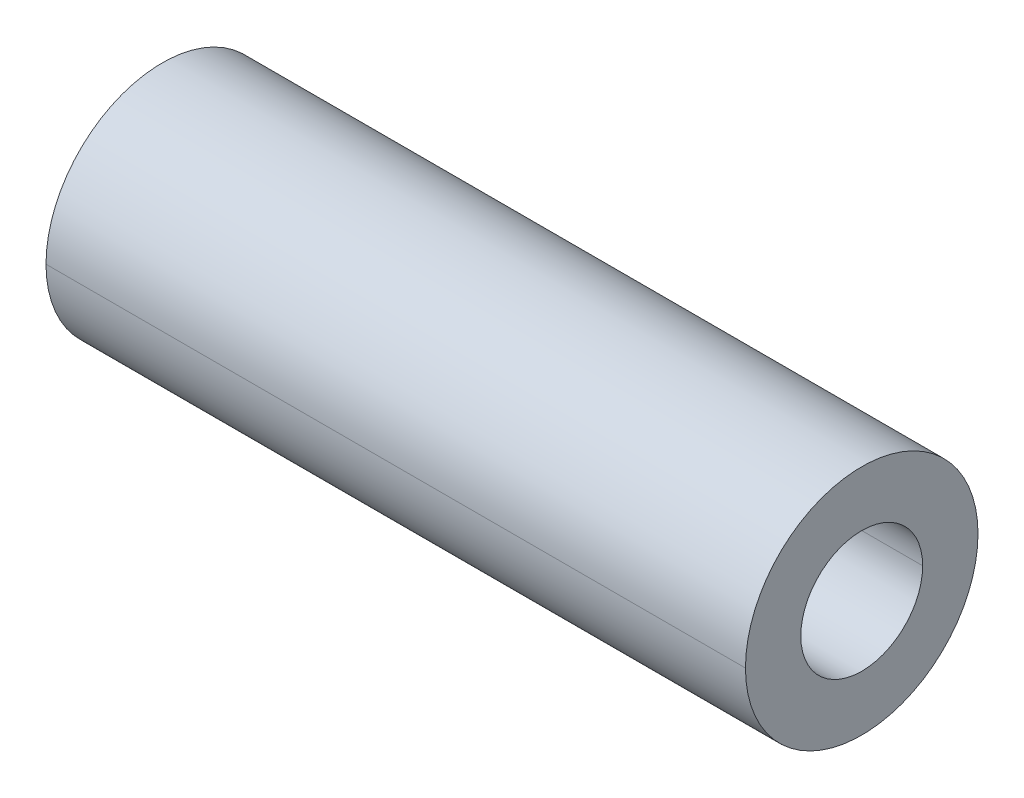
ISO-10303-21;
HEADER;
FILE_DESCRIPTION(('STEP AP214'),'2;1');
FILE_NAME('part.step','',(''),(''),'','','');
FILE_SCHEMA(('AUTOMOTIVE_DESIGN { 1 0 10303 214 1 1 1 1 }'));
ENDSEC;
DATA;
#1=APPLICATION_CONTEXT('core data for automotive mechanical design processes');
#2=APPLICATION_PROTOCOL_DEFINITION('international standard','automotive_design',2000,#1);
#3=PRODUCT_CONTEXT('',#1,'mechanical');
#4=PRODUCT('Part','Part','',(#3));
#5=PRODUCT_RELATED_PRODUCT_CATEGORY('part','',(#4));
#6=PRODUCT_DEFINITION_FORMATION('','',#4);
#7=PRODUCT_DEFINITION_CONTEXT('part definition',#1,'design');
#8=PRODUCT_DEFINITION('design','',#6,#7);
#9=PRODUCT_DEFINITION_SHAPE('','',#8);
#10=(LENGTH_UNIT() NAMED_UNIT(*) SI_UNIT(.MILLI.,.METRE.));
#11=(NAMED_UNIT(*) PLANE_ANGLE_UNIT() SI_UNIT($,.RADIAN.));
#12=(NAMED_UNIT(*) SI_UNIT($,.STERADIAN.) SOLID_ANGLE_UNIT());
#13=UNCERTAINTY_MEASURE_WITH_UNIT(LENGTH_MEASURE(1.E-05),#10,'distance_accuracy_value','');
#14=(GEOMETRIC_REPRESENTATION_CONTEXT(3) GLOBAL_UNCERTAINTY_ASSIGNED_CONTEXT((#13)) GLOBAL_UNIT_ASSIGNED_CONTEXT((#10,
#11,#12)) REPRESENTATION_CONTEXT('',''));
#15=CARTESIAN_POINT('',(0.,0.,0.));
#16=DIRECTION('',(0.,0.,1.));
#17=DIRECTION('',(1.,0.,0.));
#18=AXIS2_PLACEMENT_3D('',#15,#16,#17);
#19=CARTESIAN_POINT('',(14.2875,0.,0.));
#20=DIRECTION('',(-1.,0.,0.));
#21=DIRECTION('',(0.,0.,1.));
#22=AXIS2_PLACEMENT_3D('',#19,#20,#21);
#23=CYLINDRICAL_SURFACE('',#22,2.4892);
#24=DIRECTION('',(-1.,0.,0.));
#25=VECTOR('',#24,1.);
#26=CARTESIAN_POINT('',(14.2875,0.,-2.4892));
#27=LINE('',#26,#25);
#28=CARTESIAN_POINT('',(14.2875,0.,-2.4892));
#29=VERTEX_POINT('',#28);
#30=CARTESIAN_POINT('',(-14.2875,0.,-2.4892));
#31=VERTEX_POINT('',#30);
#32=EDGE_CURVE('E79',#29,#31,#27,.T.);
#33=ORIENTED_EDGE('',*,*,#32,.F.);
#34=CARTESIAN_POINT('',(14.2875,0.,0.));
#35=DIRECTION('',(1.,0.,0.));
#36=DIRECTION('',(0.,0.,-1.));
#37=AXIS2_PLACEMENT_3D('',#34,#35,#36);
#38=CIRCLE('',#37,2.4892);
#39=CARTESIAN_POINT('',(14.2875,0.,2.4892));
#40=VERTEX_POINT('',#39);
#41=EDGE_CURVE('E70',#29,#40,#38,.T.);
#42=ORIENTED_EDGE('',*,*,#41,.T.);
#43=DIRECTION('',(-1.,0.,0.));
#44=VECTOR('',#43,1.);
#45=CARTESIAN_POINT('',(14.2875,0.,2.4892));
#46=LINE('',#45,#44);
#47=CARTESIAN_POINT('',(-14.2875,0.,2.4892));
#48=VERTEX_POINT('',#47);
#49=EDGE_CURVE('E19',#40,#48,#46,.T.);
#50=ORIENTED_EDGE('',*,*,#49,.T.);
#51=CARTESIAN_POINT('',(-14.2875,0.,0.));
#52=DIRECTION('',(1.,0.,0.));
#53=DIRECTION('',(0.,0.,-1.));
#54=AXIS2_PLACEMENT_3D('',#51,#52,#53);
#55=CIRCLE('',#54,2.4892);
#56=EDGE_CURVE('E10',#31,#48,#55,.T.);
#57=ORIENTED_EDGE('',*,*,#56,.F.);
#58=EDGE_LOOP('',(#33,#42,#50,#57));
#59=FACE_BOUND('',#58,.T.);
#60=ADVANCED_FACE('F15',(#59),#23,.F.);
#61=CARTESIAN_POINT('',(14.2875,0.,0.));
#62=DIRECTION('',(-1.,0.,0.));
#63=DIRECTION('',(0.,0.,1.));
#64=AXIS2_PLACEMENT_3D('',#61,#62,#63);
#65=CYLINDRICAL_SURFACE('',#64,4.7498);
#66=DIRECTION('',(-1.,0.,0.));
#67=VECTOR('',#66,1.);
#68=CARTESIAN_POINT('',(14.2875,0.,-4.7498));
#69=LINE('',#68,#67);
#70=CARTESIAN_POINT('',(14.2875,0.,-4.7498));
#71=VERTEX_POINT('',#70);
#72=CARTESIAN_POINT('',(-14.2875,0.,-4.7498));
#73=VERTEX_POINT('',#72);
#74=EDGE_CURVE('E94',#71,#73,#69,.T.);
#75=ORIENTED_EDGE('',*,*,#74,.F.);
#76=CARTESIAN_POINT('',(14.2875,0.,0.));
#77=DIRECTION('',(1.,0.,0.));
#78=DIRECTION('',(0.,0.,-1.));
#79=AXIS2_PLACEMENT_3D('',#76,#77,#78);
#80=CIRCLE('',#79,4.7498);
#81=CARTESIAN_POINT('',(14.2875,0.,4.7498));
#82=VERTEX_POINT('',#81);
#83=EDGE_CURVE('E76',#82,#71,#80,.T.);
#84=ORIENTED_EDGE('',*,*,#83,.F.);
#85=DIRECTION('',(-1.,0.,0.));
#86=VECTOR('',#85,1.);
#87=CARTESIAN_POINT('',(14.2875,0.,4.7498));
#88=LINE('',#87,#86);
#89=CARTESIAN_POINT('',(-14.2875,0.,4.7498));
#90=VERTEX_POINT('',#89);
#91=EDGE_CURVE('E100',#82,#90,#88,.T.);
#92=ORIENTED_EDGE('',*,*,#91,.T.);
#93=CARTESIAN_POINT('',(-14.2875,0.,0.));
#94=DIRECTION('',(1.,0.,0.));
#95=DIRECTION('',(0.,0.,-1.));
#96=AXIS2_PLACEMENT_3D('',#93,#94,#95);
#97=CIRCLE('',#96,4.7498);
#98=EDGE_CURVE('E26',#90,#73,#97,.T.);
#99=ORIENTED_EDGE('',*,*,#98,.T.);
#100=EDGE_LOOP('',(#75,#84,#92,#99));
#101=FACE_BOUND('',#100,.T.);
#102=ADVANCED_FACE('F116',(#101),#65,.T.);
#103=CARTESIAN_POINT('',(-14.2875,0.,0.));
#104=DIRECTION('',(1.,0.,0.));
#105=DIRECTION('',(0.,1.,0.));
#106=AXIS2_PLACEMENT_3D('',#103,#104,#105);
#107=PLANE('',#106);
#108=CARTESIAN_POINT('',(-14.2875,0.,0.));
#109=DIRECTION('',(1.,0.,0.));
#110=DIRECTION('',(0.,0.,-1.));
#111=AXIS2_PLACEMENT_3D('',#108,#109,#110);
#112=CIRCLE('',#111,2.4892);
#113=EDGE_CURVE('E83',#48,#31,#112,.T.);
#114=ORIENTED_EDGE('',*,*,#113,.T.);
#115=ORIENTED_EDGE('',*,*,#56,.T.);
#116=EDGE_LOOP('',(#114,#115));
#117=FACE_BOUND('',#116,.T.);
#118=ORIENTED_EDGE('',*,*,#98,.F.);
#119=CARTESIAN_POINT('',(-14.2875,0.,0.));
#120=DIRECTION('',(1.,0.,0.));
#121=DIRECTION('',(0.,0.,-1.));
#122=AXIS2_PLACEMENT_3D('',#119,#120,#121);
#123=CIRCLE('',#122,4.7498);
#124=EDGE_CURVE('E98',#73,#90,#123,.T.);
#125=ORIENTED_EDGE('',*,*,#124,.F.);
#126=EDGE_LOOP('',(#118,#125));
#127=FACE_BOUND('',#126,.T.);
#128=ADVANCED_FACE('F120',(#117,#127),#107,.F.);
#129=CARTESIAN_POINT('',(14.2875,0.,0.));
#130=DIRECTION('',(1.,0.,0.));
#131=DIRECTION('',(0.,1.,0.));
#132=AXIS2_PLACEMENT_3D('',#129,#130,#131);
#133=PLANE('',#132);
#134=CARTESIAN_POINT('',(14.2875,0.,0.));
#135=DIRECTION('',(1.,0.,0.));
#136=DIRECTION('',(0.,0.,-1.));
#137=AXIS2_PLACEMENT_3D('',#134,#135,#136);
#138=CIRCLE('',#137,2.4892);
#139=EDGE_CURVE('E73',#40,#29,#138,.T.);
#140=ORIENTED_EDGE('',*,*,#139,.F.);
#141=ORIENTED_EDGE('',*,*,#41,.F.);
#142=EDGE_LOOP('',(#140,#141));
#143=FACE_BOUND('',#142,.T.);
#144=ORIENTED_EDGE('',*,*,#83,.T.);
#145=CARTESIAN_POINT('',(14.2875,0.,0.));
#146=DIRECTION('',(1.,0.,0.));
#147=DIRECTION('',(0.,0.,-1.));
#148=AXIS2_PLACEMENT_3D('',#145,#146,#147);
#149=CIRCLE('',#148,4.7498);
#150=EDGE_CURVE('E99',#71,#82,#149,.T.);
#151=ORIENTED_EDGE('',*,*,#150,.T.);
#152=EDGE_LOOP('',(#144,#151));
#153=FACE_BOUND('',#152,.T.);
#154=ADVANCED_FACE('F17',(#143,#153),#133,.T.);
#155=CARTESIAN_POINT('',(14.2875,0.,0.));
#156=DIRECTION('',(-1.,0.,0.));
#157=DIRECTION('',(0.,0.,1.));
#158=AXIS2_PLACEMENT_3D('',#155,#156,#157);
#159=CYLINDRICAL_SURFACE('',#158,4.7498);
#160=ORIENTED_EDGE('',*,*,#150,.F.);
#161=ORIENTED_EDGE('',*,*,#74,.T.);
#162=ORIENTED_EDGE('',*,*,#124,.T.);
#163=ORIENTED_EDGE('',*,*,#91,.F.);
#164=EDGE_LOOP('',(#160,#161,#162,#163));
#165=FACE_BOUND('',#164,.T.);
#166=ADVANCED_FACE('F122',(#165),#159,.T.);
#167=CARTESIAN_POINT('',(14.2875,0.,0.));
#168=DIRECTION('',(-1.,0.,0.));
#169=DIRECTION('',(0.,0.,1.));
#170=AXIS2_PLACEMENT_3D('',#167,#168,#169);
#171=CYLINDRICAL_SURFACE('',#170,2.4892);
#172=ORIENTED_EDGE('',*,*,#139,.T.);
#173=ORIENTED_EDGE('',*,*,#32,.T.);
#174=ORIENTED_EDGE('',*,*,#113,.F.);
#175=ORIENTED_EDGE('',*,*,#49,.F.);
#176=EDGE_LOOP('',(#172,#173,#174,#175));
#177=FACE_BOUND('',#176,.T.);
#178=ADVANCED_FACE('F85',(#177),#171,.F.);
#179=CLOSED_SHELL('',(#60,#102,#128,#154,#166,#178));
#180=MANIFOLD_SOLID_BREP('B1',#179);
#181=ADVANCED_BREP_SHAPE_REPRESENTATION('',(#18,#180),#14);
#182=SHAPE_DEFINITION_REPRESENTATION(#9,#181);
ENDSEC;
END-ISO-10303-21;
